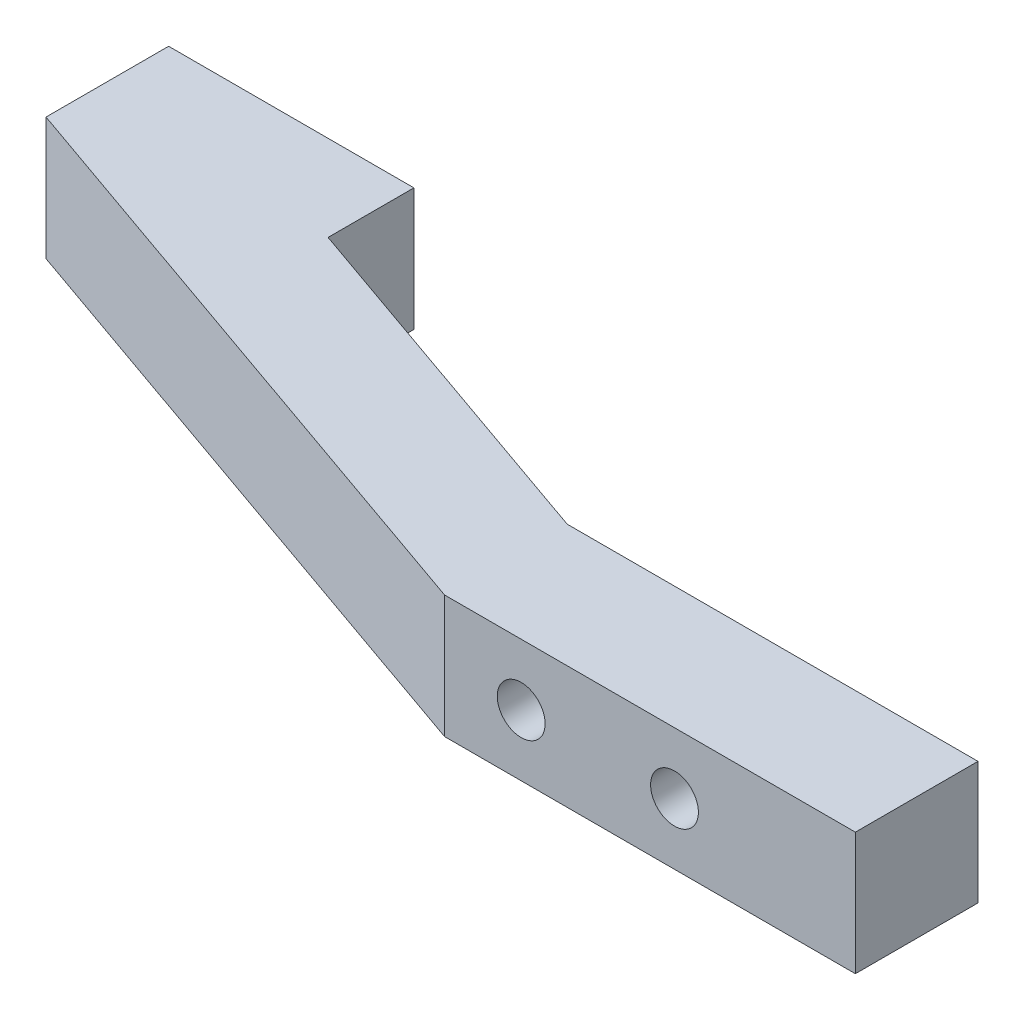
ISO-10303-21;
HEADER;
FILE_DESCRIPTION(('STEP AP214'),'2;1');
FILE_NAME('part.step','',(''),(''),'','','');
FILE_SCHEMA(('AUTOMOTIVE_DESIGN { 1 0 10303 214 1 1 1 1 }'));
ENDSEC;
DATA;
#1=APPLICATION_CONTEXT('core data for automotive mechanical design processes');
#2=APPLICATION_PROTOCOL_DEFINITION('international standard','automotive_design',2000,#1);
#3=PRODUCT_CONTEXT('',#1,'mechanical');
#4=PRODUCT('Part','Part','',(#3));
#5=PRODUCT_RELATED_PRODUCT_CATEGORY('part','',(#4));
#6=PRODUCT_DEFINITION_FORMATION('','',#4);
#7=PRODUCT_DEFINITION_CONTEXT('part definition',#1,'design');
#8=PRODUCT_DEFINITION('design','',#6,#7);
#9=PRODUCT_DEFINITION_SHAPE('','',#8);
#10=(LENGTH_UNIT() NAMED_UNIT(*) SI_UNIT(.MILLI.,.METRE.));
#11=(NAMED_UNIT(*) PLANE_ANGLE_UNIT() SI_UNIT($,.RADIAN.));
#12=(NAMED_UNIT(*) SI_UNIT($,.STERADIAN.) SOLID_ANGLE_UNIT());
#13=UNCERTAINTY_MEASURE_WITH_UNIT(LENGTH_MEASURE(1.E-05),#10,'distance_accuracy_value','');
#14=(GEOMETRIC_REPRESENTATION_CONTEXT(3) GLOBAL_UNCERTAINTY_ASSIGNED_CONTEXT((#13)) GLOBAL_UNIT_ASSIGNED_CONTEXT((#10,
#11,#12)) REPRESENTATION_CONTEXT('',''));
#15=CARTESIAN_POINT('',(0.,0.,0.));
#16=DIRECTION('',(0.,0.,1.));
#17=DIRECTION('',(1.,0.,0.));
#18=AXIS2_PLACEMENT_3D('',#15,#16,#17);
#19=CARTESIAN_POINT('',(0.,0.,4.));
#20=DIRECTION('',(0.,0.,-1.));
#21=DIRECTION('',(-1.,0.,0.));
#22=AXIS2_PLACEMENT_3D('',#19,#20,#21);
#23=PLANE('',#22);
#24=DIRECTION('',(0.,-1.,0.));
#25=VECTOR('',#24,1.);
#26=CARTESIAN_POINT('',(0.,0.,4.));
#27=LINE('',#26,#25);
#28=CARTESIAN_POINT('',(0.,4.,4.));
#29=VERTEX_POINT('',#28);
#30=CARTESIAN_POINT('',(0.,0.,4.));
#31=VERTEX_POINT('',#30);
#32=EDGE_CURVE('E190',#29,#31,#27,.T.);
#33=ORIENTED_EDGE('',*,*,#32,.T.);
#34=DIRECTION('',(1.,0.,0.));
#35=VECTOR('',#34,1.);
#36=CARTESIAN_POINT('',(0.,0.,4.));
#37=LINE('',#36,#35);
#38=CARTESIAN_POINT('',(13.4,0.,4.));
#39=VERTEX_POINT('',#38);
#40=EDGE_CURVE('E83',#31,#39,#37,.T.);
#41=ORIENTED_EDGE('',*,*,#40,.T.);
#42=DIRECTION('',(0.,1.,0.));
#43=VECTOR('',#42,1.);
#44=CARTESIAN_POINT('',(13.4,0.,4.));
#45=LINE('',#44,#43);
#46=CARTESIAN_POINT('',(13.4,4.,4.));
#47=VERTEX_POINT('',#46);
#48=EDGE_CURVE('E196',#39,#47,#45,.T.);
#49=ORIENTED_EDGE('',*,*,#48,.T.);
#50=DIRECTION('',(-1.,0.,0.));
#51=VECTOR('',#50,1.);
#52=CARTESIAN_POINT('',(0.,4.,4.));
#53=LINE('',#52,#51);
#54=EDGE_CURVE('E57',#47,#29,#53,.T.);
#55=ORIENTED_EDGE('',*,*,#54,.T.);
#56=EDGE_LOOP('',(#33,#41,#49,#55));
#57=FACE_BOUND('',#56,.T.);
#58=CARTESIAN_POINT('',(2.5,2.,4.));
#59=DIRECTION('',(0.,0.,1.));
#60=DIRECTION('',(1.,0.,0.));
#61=AXIS2_PLACEMENT_3D('',#58,#59,#60);
#62=CIRCLE('',#61,0.78);
#63=CARTESIAN_POINT('',(3.28,2.,4.));
#64=VERTEX_POINT('',#63);
#65=EDGE_CURVE('E182',#64,#64,#62,.T.);
#66=ORIENTED_EDGE('',*,*,#65,.F.);
#67=EDGE_LOOP('',(#66));
#68=FACE_BOUND('',#67,.T.);
#69=CARTESIAN_POINT('',(7.5,2.,4.));
#70=DIRECTION('',(0.,0.,1.));
#71=DIRECTION('',(1.,0.,0.));
#72=AXIS2_PLACEMENT_3D('',#69,#70,#71);
#73=CIRCLE('',#72,0.779999999999999);
#74=CARTESIAN_POINT('',(8.28,2.,4.));
#75=VERTEX_POINT('',#74);
#76=EDGE_CURVE('E174',#75,#75,#73,.T.);
#77=ORIENTED_EDGE('',*,*,#76,.F.);
#78=EDGE_LOOP('',(#77));
#79=FACE_BOUND('',#78,.T.);
#80=ADVANCED_FACE('F39',(#57,#68,#79),#23,.F.);
#81=CARTESIAN_POINT('',(0.,0.,0.));
#82=DIRECTION('',(0.,0.,-1.));
#83=DIRECTION('',(-1.,0.,0.));
#84=AXIS2_PLACEMENT_3D('',#81,#82,#83);
#85=PLANE('',#84);
#86=CARTESIAN_POINT('',(2.5,2.,0.));
#87=DIRECTION('',(0.,0.,1.));
#88=DIRECTION('',(1.,0.,0.));
#89=AXIS2_PLACEMENT_3D('',#86,#87,#88);
#90=CIRCLE('',#89,0.78);
#91=CARTESIAN_POINT('',(3.28,2.,0.));
#92=VERTEX_POINT('',#91);
#93=EDGE_CURVE('E178',#92,#92,#90,.T.);
#94=ORIENTED_EDGE('',*,*,#93,.T.);
#95=EDGE_LOOP('',(#94));
#96=FACE_BOUND('',#95,.T.);
#97=DIRECTION('',(0.,-1.,0.));
#98=VECTOR('',#97,1.);
#99=CARTESIAN_POINT('',(0.,0.,0.));
#100=LINE('',#99,#98);
#101=CARTESIAN_POINT('',(0.,4.,0.));
#102=VERTEX_POINT('',#101);
#103=CARTESIAN_POINT('',(0.,0.,0.));
#104=VERTEX_POINT('',#103);
#105=EDGE_CURVE('E186',#102,#104,#100,.T.);
#106=ORIENTED_EDGE('',*,*,#105,.F.);
#107=DIRECTION('',(-1.,0.,0.));
#108=VECTOR('',#107,1.);
#109=CARTESIAN_POINT('',(0.,4.,0.));
#110=LINE('',#109,#108);
#111=CARTESIAN_POINT('',(13.4,4.,0.));
#112=VERTEX_POINT('',#111);
#113=EDGE_CURVE('E193',#112,#102,#110,.T.);
#114=ORIENTED_EDGE('',*,*,#113,.F.);
#115=DIRECTION('',(0.,1.,0.));
#116=VECTOR('',#115,1.);
#117=CARTESIAN_POINT('',(13.4,0.,0.));
#118=LINE('',#117,#116);
#119=CARTESIAN_POINT('',(13.4,0.,0.));
#120=VERTEX_POINT('',#119);
#121=EDGE_CURVE('E77',#120,#112,#118,.T.);
#122=ORIENTED_EDGE('',*,*,#121,.F.);
#123=DIRECTION('',(1.,0.,0.));
#124=VECTOR('',#123,1.);
#125=CARTESIAN_POINT('',(0.,0.,0.));
#126=LINE('',#125,#124);
#127=EDGE_CURVE('E71',#104,#120,#126,.T.);
#128=ORIENTED_EDGE('',*,*,#127,.F.);
#129=EDGE_LOOP('',(#106,#114,#122,#128));
#130=FACE_BOUND('',#129,.T.);
#131=CARTESIAN_POINT('',(7.5,2.,0.));
#132=DIRECTION('',(0.,0.,1.));
#133=DIRECTION('',(1.,0.,0.));
#134=AXIS2_PLACEMENT_3D('',#131,#132,#133);
#135=CIRCLE('',#134,0.779999999999999);
#136=CARTESIAN_POINT('',(8.28,2.,0.));
#137=VERTEX_POINT('',#136);
#138=EDGE_CURVE('E171',#137,#137,#135,.T.);
#139=ORIENTED_EDGE('',*,*,#138,.T.);
#140=EDGE_LOOP('',(#139));
#141=FACE_BOUND('',#140,.T.);
#142=ADVANCED_FACE('F217',(#96,#130,#141),#85,.T.);
#143=CARTESIAN_POINT('',(0.,0.,4.));
#144=DIRECTION('',(0.,1.,0.));
#145=DIRECTION('',(0.,0.,1.));
#146=AXIS2_PLACEMENT_3D('',#143,#144,#145);
#147=PLANE('',#146);
#148=ORIENTED_EDGE('',*,*,#127,.T.);
#149=DIRECTION('',(0.,0.,-1.));
#150=VECTOR('',#149,1.);
#151=CARTESIAN_POINT('',(13.4,0.,4.));
#152=LINE('',#151,#150);
#153=EDGE_CURVE('E11',#39,#120,#152,.T.);
#154=ORIENTED_EDGE('',*,*,#153,.F.);
#155=ORIENTED_EDGE('',*,*,#40,.F.);
#156=DIRECTION('',(0.943858356366017,0.,0.330350424728106));
#157=VECTOR('',#156,1.);
#158=CARTESIAN_POINT('',(0.,0.,4.));
#159=LINE('',#158,#157);
#160=CARTESIAN_POINT('',(-20.,0.,-3.));
#161=VERTEX_POINT('',#160);
#162=EDGE_CURVE('E151',#161,#31,#159,.T.);
#163=ORIENTED_EDGE('',*,*,#162,.F.);
#164=DIRECTION('',(0.,0.,1.));
#165=VECTOR('',#164,1.);
#166=CARTESIAN_POINT('',(-20.,0.,-3.));
#167=LINE('',#166,#165);
#168=CARTESIAN_POINT('',(-20.,0.,-7.));
#169=VERTEX_POINT('',#168);
#170=EDGE_CURVE('E122',#169,#161,#167,.T.);
#171=ORIENTED_EDGE('',*,*,#170,.F.);
#172=DIRECTION('',(-1.,0.,0.));
#173=VECTOR('',#172,1.);
#174=CARTESIAN_POINT('',(-12.,0.,-7.));
#175=LINE('',#174,#173);
#176=CARTESIAN_POINT('',(-12.,0.,-7.));
#177=VERTEX_POINT('',#176);
#178=EDGE_CURVE('E126',#177,#169,#175,.T.);
#179=ORIENTED_EDGE('',*,*,#178,.F.);
#180=DIRECTION('',(0.,0.,-1.));
#181=VECTOR('',#180,1.);
#182=CARTESIAN_POINT('',(-12.,0.,-6.));
#183=LINE('',#182,#181);
#184=CARTESIAN_POINT('',(-12.,0.,-4.2));
#185=VERTEX_POINT('',#184);
#186=EDGE_CURVE('E113',#185,#177,#183,.T.);
#187=ORIENTED_EDGE('',*,*,#186,.F.);
#188=DIRECTION('',(-0.943858356366017,0.,-0.330350424728106));
#189=VECTOR('',#188,1.);
#190=CARTESIAN_POINT('',(-12.,0.,-4.2));
#191=LINE('',#190,#189);
#192=EDGE_CURVE('E123',#104,#185,#191,.T.);
#193=ORIENTED_EDGE('',*,*,#192,.F.);
#194=EDGE_LOOP('',(#148,#154,#155,#163,#171,#179,#187,#193));
#195=FACE_BOUND('',#194,.T.);
#196=ADVANCED_FACE('F41',(#195),#147,.F.);
#197=CARTESIAN_POINT('',(13.4,0.,4.));
#198=DIRECTION('',(-1.,0.,0.));
#199=DIRECTION('',(0.,0.,1.));
#200=AXIS2_PLACEMENT_3D('',#197,#198,#199);
#201=PLANE('',#200);
#202=ORIENTED_EDGE('',*,*,#121,.T.);
#203=DIRECTION('',(0.,0.,-1.));
#204=VECTOR('',#203,1.);
#205=CARTESIAN_POINT('',(13.4,4.,4.));
#206=LINE('',#205,#204);
#207=EDGE_CURVE('E49',#47,#112,#206,.T.);
#208=ORIENTED_EDGE('',*,*,#207,.F.);
#209=ORIENTED_EDGE('',*,*,#48,.F.);
#210=ORIENTED_EDGE('',*,*,#153,.T.);
#211=EDGE_LOOP('',(#202,#208,#209,#210));
#212=FACE_BOUND('',#211,.T.);
#213=ADVANCED_FACE('F226',(#212),#201,.F.);
#214=CARTESIAN_POINT('',(0.,4.,4.));
#215=DIRECTION('',(0.,-1.,0.));
#216=DIRECTION('',(0.,0.,-1.));
#217=AXIS2_PLACEMENT_3D('',#214,#215,#216);
#218=PLANE('',#217);
#219=ORIENTED_EDGE('',*,*,#113,.T.);
#220=DIRECTION('',(-0.943858356366017,0.,-0.330350424728106));
#221=VECTOR('',#220,1.);
#222=CARTESIAN_POINT('',(-12.,4.,-4.2));
#223=LINE('',#222,#221);
#224=CARTESIAN_POINT('',(-12.,4.,-4.2));
#225=VERTEX_POINT('',#224);
#226=EDGE_CURVE('E145',#102,#225,#223,.T.);
#227=ORIENTED_EDGE('',*,*,#226,.T.);
#228=DIRECTION('',(0.,0.,-1.));
#229=VECTOR('',#228,1.);
#230=CARTESIAN_POINT('',(-12.,4.,-6.));
#231=LINE('',#230,#229);
#232=CARTESIAN_POINT('',(-12.,4.,-7.));
#233=VERTEX_POINT('',#232);
#234=EDGE_CURVE('E158',#225,#233,#231,.T.);
#235=ORIENTED_EDGE('',*,*,#234,.T.);
#236=DIRECTION('',(1.,0.,0.));
#237=VECTOR('',#236,1.);
#238=CARTESIAN_POINT('',(-12.,4.,-7.));
#239=LINE('',#238,#237);
#240=CARTESIAN_POINT('',(-20.,4.,-7.));
#241=VERTEX_POINT('',#240);
#242=EDGE_CURVE('E137',#241,#233,#239,.T.);
#243=ORIENTED_EDGE('',*,*,#242,.F.);
#244=DIRECTION('',(0.,0.,1.));
#245=VECTOR('',#244,1.);
#246=CARTESIAN_POINT('',(-20.,4.,-3.));
#247=LINE('',#246,#245);
#248=CARTESIAN_POINT('',(-20.,4.,-3.));
#249=VERTEX_POINT('',#248);
#250=EDGE_CURVE('E161',#241,#249,#247,.T.);
#251=ORIENTED_EDGE('',*,*,#250,.T.);
#252=DIRECTION('',(0.943858356366017,0.,0.330350424728106));
#253=VECTOR('',#252,1.);
#254=CARTESIAN_POINT('',(0.,4.,4.));
#255=LINE('',#254,#253);
#256=EDGE_CURVE('E147',#249,#29,#255,.T.);
#257=ORIENTED_EDGE('',*,*,#256,.T.);
#258=ORIENTED_EDGE('',*,*,#54,.F.);
#259=ORIENTED_EDGE('',*,*,#207,.T.);
#260=EDGE_LOOP('',(#219,#227,#235,#243,#251,#257,#258,#259));
#261=FACE_BOUND('',#260,.T.);
#262=ADVANCED_FACE('F213',(#261),#218,.F.);
#263=CARTESIAN_POINT('',(2.5,2.,4.));
#264=DIRECTION('',(0.,0.,-1.));
#265=DIRECTION('',(-1.,0.,0.));
#266=AXIS2_PLACEMENT_3D('',#263,#264,#265);
#267=CYLINDRICAL_SURFACE('',#266,0.78);
#268=ORIENTED_EDGE('',*,*,#65,.T.);
#269=EDGE_LOOP('',(#268));
#270=FACE_BOUND('',#269,.T.);
#271=ORIENTED_EDGE('',*,*,#93,.F.);
#272=EDGE_LOOP('',(#271));
#273=FACE_BOUND('',#272,.T.);
#274=ADVANCED_FACE('F233',(#270,#273),#267,.F.);
#275=CARTESIAN_POINT('',(7.5,2.,4.));
#276=DIRECTION('',(0.,0.,-1.));
#277=DIRECTION('',(-1.,0.,0.));
#278=AXIS2_PLACEMENT_3D('',#275,#276,#277);
#279=CYLINDRICAL_SURFACE('',#278,0.779999999999999);
#280=ORIENTED_EDGE('',*,*,#76,.T.);
#281=EDGE_LOOP('',(#280));
#282=FACE_BOUND('',#281,.T.);
#283=ORIENTED_EDGE('',*,*,#138,.F.);
#284=EDGE_LOOP('',(#283));
#285=FACE_BOUND('',#284,.T.);
#286=ADVANCED_FACE('F244',(#282,#285),#279,.F.);
#287=CARTESIAN_POINT('',(0.,0.,4.));
#288=DIRECTION('',(-0.330350424728106,0.,0.943858356366017));
#289=DIRECTION('',(0.943858356366017,0.,0.330350424728106));
#290=AXIS2_PLACEMENT_3D('',#287,#288,#289);
#291=PLANE('',#290);
#292=ORIENTED_EDGE('',*,*,#256,.F.);
#293=DIRECTION('',(0.,1.,0.));
#294=VECTOR('',#293,1.);
#295=CARTESIAN_POINT('',(-20.,0.,-3.));
#296=LINE('',#295,#294);
#297=EDGE_CURVE('E168',#161,#249,#296,.T.);
#298=ORIENTED_EDGE('',*,*,#297,.F.);
#299=ORIENTED_EDGE('',*,*,#162,.T.);
#300=ORIENTED_EDGE('',*,*,#32,.F.);
#301=EDGE_LOOP('',(#292,#298,#299,#300));
#302=FACE_BOUND('',#301,.T.);
#303=ADVANCED_FACE('F224',(#302),#291,.T.);
#304=CARTESIAN_POINT('',(-20.,0.,-3.));
#305=DIRECTION('',(-1.,0.,0.));
#306=DIRECTION('',(0.,0.,1.));
#307=AXIS2_PLACEMENT_3D('',#304,#305,#306);
#308=PLANE('',#307);
#309=ORIENTED_EDGE('',*,*,#250,.F.);
#310=DIRECTION('',(0.,1.,0.));
#311=VECTOR('',#310,1.);
#312=CARTESIAN_POINT('',(-20.,4.,-7.));
#313=LINE('',#312,#311);
#314=EDGE_CURVE('E132',#169,#241,#313,.T.);
#315=ORIENTED_EDGE('',*,*,#314,.F.);
#316=ORIENTED_EDGE('',*,*,#170,.T.);
#317=ORIENTED_EDGE('',*,*,#297,.T.);
#318=EDGE_LOOP('',(#309,#315,#316,#317));
#319=FACE_BOUND('',#318,.T.);
#320=ADVANCED_FACE('F253',(#319),#308,.T.);
#321=CARTESIAN_POINT('',(-12.,0.,-6.));
#322=DIRECTION('',(1.,0.,0.));
#323=DIRECTION('',(0.,0.,-1.));
#324=AXIS2_PLACEMENT_3D('',#321,#322,#323);
#325=PLANE('',#324);
#326=ORIENTED_EDGE('',*,*,#234,.F.);
#327=DIRECTION('',(0.,1.,0.));
#328=VECTOR('',#327,1.);
#329=CARTESIAN_POINT('',(-12.,0.,-4.2));
#330=LINE('',#329,#328);
#331=EDGE_CURVE('E119',#185,#225,#330,.T.);
#332=ORIENTED_EDGE('',*,*,#331,.F.);
#333=ORIENTED_EDGE('',*,*,#186,.T.);
#334=DIRECTION('',(0.,-1.,0.));
#335=VECTOR('',#334,1.);
#336=CARTESIAN_POINT('',(-12.,4.,-7.));
#337=LINE('',#336,#335);
#338=EDGE_CURVE('E118',#233,#177,#337,.T.);
#339=ORIENTED_EDGE('',*,*,#338,.F.);
#340=EDGE_LOOP('',(#326,#332,#333,#339));
#341=FACE_BOUND('',#340,.T.);
#342=ADVANCED_FACE('F116',(#341),#325,.T.);
#343=CARTESIAN_POINT('',(-12.,0.,-4.2));
#344=DIRECTION('',(0.330350424728106,0.,-0.943858356366017));
#345=DIRECTION('',(-0.943858356366018,0.,-0.330350424728106));
#346=AXIS2_PLACEMENT_3D('',#343,#344,#345);
#347=PLANE('',#346);
#348=ORIENTED_EDGE('',*,*,#226,.F.);
#349=ORIENTED_EDGE('',*,*,#105,.T.);
#350=ORIENTED_EDGE('',*,*,#192,.T.);
#351=ORIENTED_EDGE('',*,*,#331,.T.);
#352=EDGE_LOOP('',(#348,#349,#350,#351));
#353=FACE_BOUND('',#352,.T.);
#354=ADVANCED_FACE('F220',(#353),#347,.T.);
#355=CARTESIAN_POINT('',(0.,0.,-7.));
#356=DIRECTION('',(0.,0.,-1.));
#357=DIRECTION('',(-1.,0.,0.));
#358=AXIS2_PLACEMENT_3D('',#355,#356,#357);
#359=PLANE('',#358);
#360=ORIENTED_EDGE('',*,*,#338,.T.);
#361=ORIENTED_EDGE('',*,*,#178,.T.);
#362=ORIENTED_EDGE('',*,*,#314,.T.);
#363=ORIENTED_EDGE('',*,*,#242,.T.);
#364=EDGE_LOOP('',(#360,#361,#362,#363));
#365=FACE_BOUND('',#364,.T.);
#366=ADVANCED_FACE('F135',(#365),#359,.T.);
#367=CLOSED_SHELL('',(#80,#142,#196,#213,#262,#274,#286,#303,#320,#342,#354,#366));
#368=MANIFOLD_SOLID_BREP('B2',#367);
#369=ADVANCED_BREP_SHAPE_REPRESENTATION('',(#18,#368),#14);
#370=SHAPE_DEFINITION_REPRESENTATION(#9,#369);
ENDSEC;
END-ISO-10303-21;
